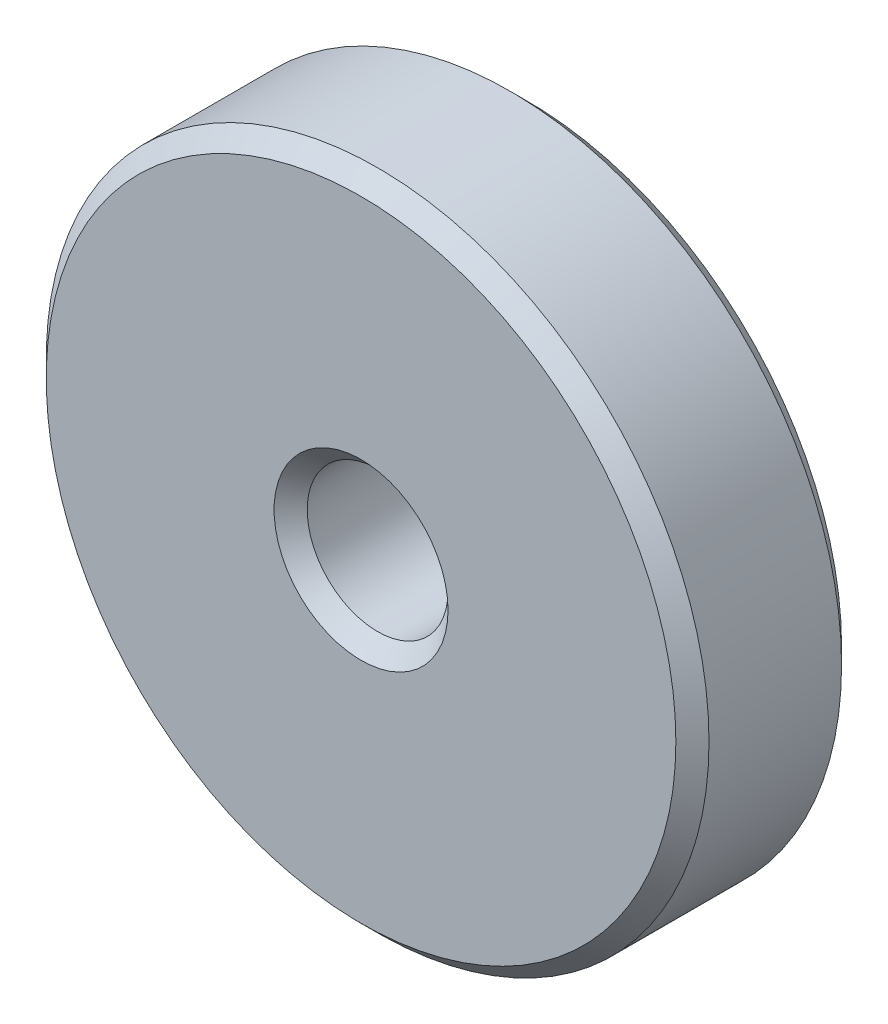
ISO-10303-21;
HEADER;
FILE_DESCRIPTION(('STEP AP214'),'2;1');
FILE_NAME('part.step','',(''),(''),'','','');
FILE_SCHEMA(('AUTOMOTIVE_DESIGN { 1 0 10303 214 1 1 1 1 }'));
ENDSEC;
DATA;
#1=APPLICATION_CONTEXT('core data for automotive mechanical design processes');
#2=APPLICATION_PROTOCOL_DEFINITION('international standard','automotive_design',2000,#1);
#3=PRODUCT_CONTEXT('',#1,'mechanical');
#4=PRODUCT('Part','Part','',(#3));
#5=PRODUCT_RELATED_PRODUCT_CATEGORY('part','',(#4));
#6=PRODUCT_DEFINITION_FORMATION('','',#4);
#7=PRODUCT_DEFINITION_CONTEXT('part definition',#1,'design');
#8=PRODUCT_DEFINITION('design','',#6,#7);
#9=PRODUCT_DEFINITION_SHAPE('','',#8);
#10=(LENGTH_UNIT() NAMED_UNIT(*) SI_UNIT(.MILLI.,.METRE.));
#11=(NAMED_UNIT(*) PLANE_ANGLE_UNIT() SI_UNIT($,.RADIAN.));
#12=(NAMED_UNIT(*) SI_UNIT($,.STERADIAN.) SOLID_ANGLE_UNIT());
#13=UNCERTAINTY_MEASURE_WITH_UNIT(LENGTH_MEASURE(1.E-05),#10,'distance_accuracy_value','');
#14=(GEOMETRIC_REPRESENTATION_CONTEXT(3) GLOBAL_UNCERTAINTY_ASSIGNED_CONTEXT((#13)) GLOBAL_UNIT_ASSIGNED_CONTEXT((#10,
#11,#12)) REPRESENTATION_CONTEXT('',''));
#15=CARTESIAN_POINT('',(0.,0.,0.));
#16=DIRECTION('',(0.,0.,1.));
#17=DIRECTION('',(1.,0.,0.));
#18=AXIS2_PLACEMENT_3D('',#15,#16,#17);
#19=CARTESIAN_POINT('',(0.,0.,10.));
#20=DIRECTION('',(0.,0.,1.));
#21=DIRECTION('',(1.,0.,0.));
#22=AXIS2_PLACEMENT_3D('',#19,#20,#21);
#23=PLANE('',#22);
#24=CARTESIAN_POINT('',(0.,0.,10.));
#25=DIRECTION('',(0.,0.,1.));
#26=DIRECTION('',(1.,0.,0.));
#27=AXIS2_PLACEMENT_3D('',#24,#25,#26);
#28=CIRCLE('',#27,5.24999999999999);
#29=CARTESIAN_POINT('',(5.24999999999999,0.,10.));
#30=VERTEX_POINT('',#29);
#31=EDGE_CURVE('E10',#30,#30,#28,.F.);
#32=ORIENTED_EDGE('',*,*,#31,.T.);
#33=EDGE_LOOP('',(#32));
#34=FACE_BOUND('',#33,.T.);
#35=CARTESIAN_POINT('',(0.,0.,10.));
#36=DIRECTION('',(0.,0.,1.));
#37=DIRECTION('',(1.,0.,0.));
#38=AXIS2_PLACEMENT_3D('',#35,#36,#37);
#39=CIRCLE('',#38,19.);
#40=CARTESIAN_POINT('',(19.,0.,10.));
#41=VERTEX_POINT('',#40);
#42=EDGE_CURVE('E37',#41,#41,#39,.T.);
#43=ORIENTED_EDGE('',*,*,#42,.T.);
#44=EDGE_LOOP('',(#43));
#45=FACE_BOUND('',#44,.T.);
#46=ADVANCED_FACE('F30',(#34,#45),#23,.T.);
#47=CARTESIAN_POINT('',(0.,0.,0.));
#48=DIRECTION('',(0.,0.,1.));
#49=DIRECTION('',(1.,0.,0.));
#50=AXIS2_PLACEMENT_3D('',#47,#48,#49);
#51=PLANE('',#50);
#52=CARTESIAN_POINT('',(0.,0.,0.));
#53=DIRECTION('',(0.,0.,1.));
#54=DIRECTION('',(1.,0.,0.));
#55=AXIS2_PLACEMENT_3D('',#52,#53,#54);
#56=CIRCLE('',#55,5.25);
#57=CARTESIAN_POINT('',(5.25,0.,0.));
#58=VERTEX_POINT('',#57);
#59=EDGE_CURVE('E56',#58,#58,#56,.T.);
#60=ORIENTED_EDGE('',*,*,#59,.T.);
#61=EDGE_LOOP('',(#60));
#62=FACE_BOUND('',#61,.T.);
#63=CARTESIAN_POINT('',(0.,0.,0.));
#64=DIRECTION('',(0.,0.,1.));
#65=DIRECTION('',(1.,0.,0.));
#66=AXIS2_PLACEMENT_3D('',#63,#64,#65);
#67=CIRCLE('',#66,19.);
#68=CARTESIAN_POINT('',(19.,0.,0.));
#69=VERTEX_POINT('',#68);
#70=EDGE_CURVE('E59',#69,#69,#67,.F.);
#71=ORIENTED_EDGE('',*,*,#70,.T.);
#72=EDGE_LOOP('',(#71));
#73=FACE_BOUND('',#72,.T.);
#74=ADVANCED_FACE('F63',(#62,#73),#51,.F.);
#75=CARTESIAN_POINT('',(0.,0.,10.));
#76=DIRECTION('',(0.,0.,-1.));
#77=DIRECTION('',(-1.,0.,0.));
#78=AXIS2_PLACEMENT_3D('',#75,#76,#77);
#79=CYLINDRICAL_SURFACE('',#78,20.);
#80=CARTESIAN_POINT('',(0.,0.,1.));
#81=DIRECTION('',(0.,0.,1.));
#82=DIRECTION('',(1.,0.,0.));
#83=AXIS2_PLACEMENT_3D('',#80,#81,#82);
#84=CIRCLE('',#83,20.);
#85=CARTESIAN_POINT('',(20.,0.,1.));
#86=VERTEX_POINT('',#85);
#87=EDGE_CURVE('E41',#86,#86,#84,.T.);
#88=ORIENTED_EDGE('',*,*,#87,.T.);
#89=EDGE_LOOP('',(#88));
#90=FACE_BOUND('',#89,.T.);
#91=CARTESIAN_POINT('',(0.,0.,9.00000000000001));
#92=DIRECTION('',(0.,0.,1.));
#93=DIRECTION('',(1.,0.,0.));
#94=AXIS2_PLACEMENT_3D('',#91,#92,#93);
#95=CIRCLE('',#94,20.);
#96=CARTESIAN_POINT('',(20.,0.,9.00000000000001));
#97=VERTEX_POINT('',#96);
#98=EDGE_CURVE('E45',#97,#97,#95,.F.);
#99=ORIENTED_EDGE('',*,*,#98,.T.);
#100=EDGE_LOOP('',(#99));
#101=FACE_BOUND('',#100,.T.);
#102=ADVANCED_FACE('F73',(#90,#101),#79,.T.);
#103=CARTESIAN_POINT('',(0.,0.,10.));
#104=DIRECTION('',(0.,0.,-1.));
#105=DIRECTION('',(-1.,0.,0.));
#106=AXIS2_PLACEMENT_3D('',#103,#104,#105);
#107=CYLINDRICAL_SURFACE('',#106,4.25);
#108=CARTESIAN_POINT('',(0.,0.,1.));
#109=DIRECTION('',(0.,0.,1.));
#110=DIRECTION('',(1.,0.,0.));
#111=AXIS2_PLACEMENT_3D('',#108,#109,#110);
#112=CIRCLE('',#111,4.25);
#113=CARTESIAN_POINT('',(4.25,0.,1.));
#114=VERTEX_POINT('',#113);
#115=EDGE_CURVE('E50',#114,#114,#112,.F.);
#116=ORIENTED_EDGE('',*,*,#115,.T.);
#117=EDGE_LOOP('',(#116));
#118=FACE_BOUND('',#117,.T.);
#119=CARTESIAN_POINT('',(0.,0.,9.00000000000002));
#120=DIRECTION('',(0.,0.,1.));
#121=DIRECTION('',(1.,0.,0.));
#122=AXIS2_PLACEMENT_3D('',#119,#120,#121);
#123=CIRCLE('',#122,4.25);
#124=CARTESIAN_POINT('',(4.25,0.,9.00000000000002));
#125=VERTEX_POINT('',#124);
#126=EDGE_CURVE('E53',#125,#125,#123,.T.);
#127=ORIENTED_EDGE('',*,*,#126,.T.);
#128=EDGE_LOOP('',(#127));
#129=FACE_BOUND('',#128,.T.);
#130=ADVANCED_FACE('F76',(#118,#129),#107,.F.);
#131=CARTESIAN_POINT('',(0.,0.,0.));
#132=DIRECTION('',(0.,0.,-1.));
#133=DIRECTION('',(-1.,0.,0.));
#134=AXIS2_PLACEMENT_3D('',#131,#132,#133);
#135=CONICAL_SURFACE('',#134,5.25,0.785398163397445);
#136=ORIENTED_EDGE('',*,*,#115,.F.);
#137=EDGE_LOOP('',(#136));
#138=FACE_BOUND('',#137,.T.);
#139=ORIENTED_EDGE('',*,*,#59,.F.);
#140=EDGE_LOOP('',(#139));
#141=FACE_BOUND('',#140,.T.);
#142=ADVANCED_FACE('F69',(#138,#141),#135,.F.);
#143=CARTESIAN_POINT('',(0.,0.,1.));
#144=DIRECTION('',(0.,0.,1.));
#145=DIRECTION('',(1.,0.,0.));
#146=AXIS2_PLACEMENT_3D('',#143,#144,#145);
#147=CONICAL_SURFACE('',#146,20.,0.78539816339745);
#148=ORIENTED_EDGE('',*,*,#70,.F.);
#149=EDGE_LOOP('',(#148));
#150=FACE_BOUND('',#149,.T.);
#151=ORIENTED_EDGE('',*,*,#87,.F.);
#152=EDGE_LOOP('',(#151));
#153=FACE_BOUND('',#152,.T.);
#154=ADVANCED_FACE('F65',(#150,#153),#147,.T.);
#155=CARTESIAN_POINT('',(0.,0.,9.00000000000002));
#156=DIRECTION('',(0.,0.,1.));
#157=DIRECTION('',(1.,0.,0.));
#158=AXIS2_PLACEMENT_3D('',#155,#156,#157);
#159=CONICAL_SURFACE('',#158,4.25,0.785398163397452);
#160=ORIENTED_EDGE('',*,*,#31,.F.);
#161=EDGE_LOOP('',(#160));
#162=FACE_BOUND('',#161,.T.);
#163=ORIENTED_EDGE('',*,*,#126,.F.);
#164=EDGE_LOOP('',(#163));
#165=FACE_BOUND('',#164,.T.);
#166=ADVANCED_FACE('F68',(#162,#165),#159,.F.);
#167=CARTESIAN_POINT('',(0.,0.,10.));
#168=DIRECTION('',(0.,0.,-1.));
#169=DIRECTION('',(-1.,0.,0.));
#170=AXIS2_PLACEMENT_3D('',#167,#168,#169);
#171=CONICAL_SURFACE('',#170,19.,0.785398163397447);
#172=ORIENTED_EDGE('',*,*,#98,.F.);
#173=EDGE_LOOP('',(#172));
#174=FACE_BOUND('',#173,.T.);
#175=ORIENTED_EDGE('',*,*,#42,.F.);
#176=EDGE_LOOP('',(#175));
#177=FACE_BOUND('',#176,.T.);
#178=ADVANCED_FACE('F32',(#174,#177),#171,.T.);
#179=CLOSED_SHELL('',(#46,#74,#102,#130,#142,#154,#166,#178));
#180=MANIFOLD_SOLID_BREP('B2',#179);
#181=ADVANCED_BREP_SHAPE_REPRESENTATION('',(#18,#180),#14);
#182=SHAPE_DEFINITION_REPRESENTATION(#9,#181);
ENDSEC;
END-ISO-10303-21;
